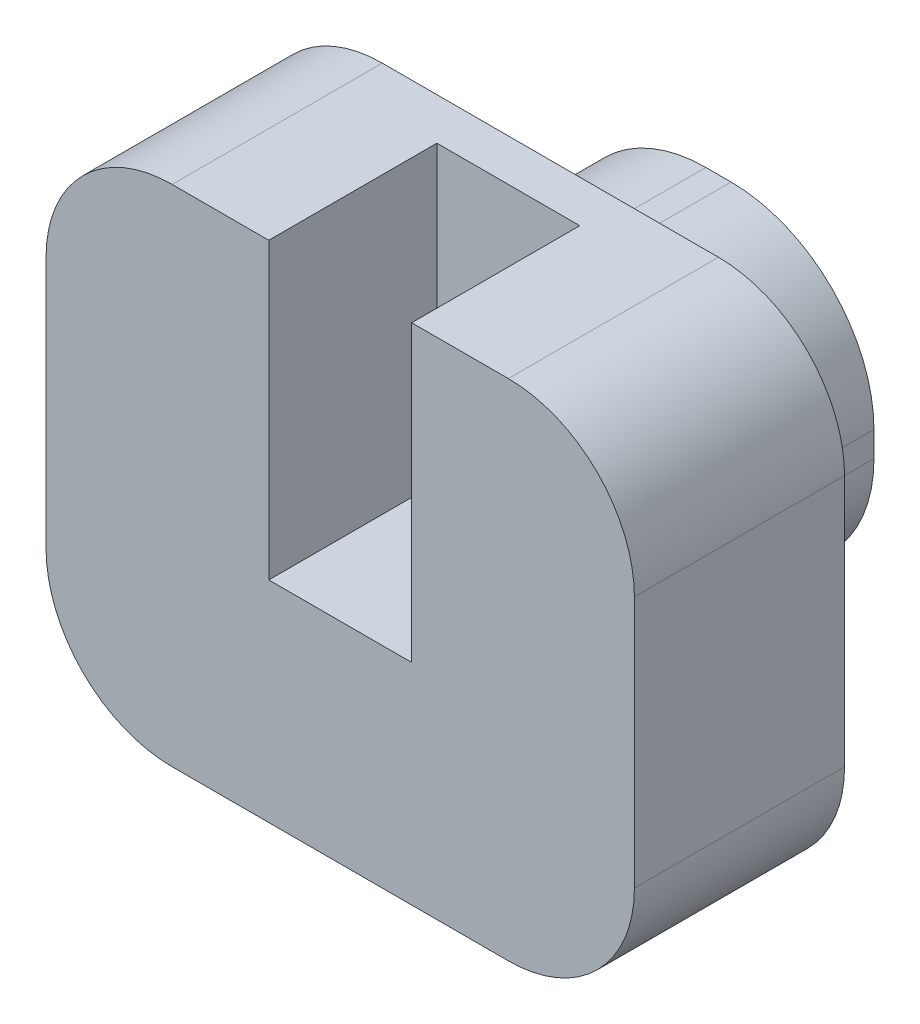
ISO-10303-21;
HEADER;
FILE_DESCRIPTION(('STEP AP214'),'2;1');
FILE_NAME('part.step','',(''),(''),'','','');
FILE_SCHEMA(('AUTOMOTIVE_DESIGN { 1 0 10303 214 1 1 1 1 }'));
ENDSEC;
DATA;
#1=APPLICATION_CONTEXT('core data for automotive mechanical design processes');
#2=APPLICATION_PROTOCOL_DEFINITION('international standard','automotive_design',2000,#1);
#3=PRODUCT_CONTEXT('',#1,'mechanical');
#4=PRODUCT('Part','Part','',(#3));
#5=PRODUCT_RELATED_PRODUCT_CATEGORY('part','',(#4));
#6=PRODUCT_DEFINITION_FORMATION('','',#4);
#7=PRODUCT_DEFINITION_CONTEXT('part definition',#1,'design');
#8=PRODUCT_DEFINITION('design','',#6,#7);
#9=PRODUCT_DEFINITION_SHAPE('','',#8);
#10=(LENGTH_UNIT() NAMED_UNIT(*) SI_UNIT(.MILLI.,.METRE.));
#11=(NAMED_UNIT(*) PLANE_ANGLE_UNIT() SI_UNIT($,.RADIAN.));
#12=(NAMED_UNIT(*) SI_UNIT($,.STERADIAN.) SOLID_ANGLE_UNIT());
#13=UNCERTAINTY_MEASURE_WITH_UNIT(LENGTH_MEASURE(1.E-05),#10,'distance_accuracy_value','');
#14=(GEOMETRIC_REPRESENTATION_CONTEXT(3) GLOBAL_UNCERTAINTY_ASSIGNED_CONTEXT((#13)) GLOBAL_UNIT_ASSIGNED_CONTEXT((#10,
#11,#12)) REPRESENTATION_CONTEXT('',''));
#15=CARTESIAN_POINT('',(0.,0.,0.));
#16=DIRECTION('',(0.,0.,1.));
#17=DIRECTION('',(1.,0.,0.));
#18=AXIS2_PLACEMENT_3D('',#15,#16,#17);
#19=CARTESIAN_POINT('',(-0.15,-0.15,2.));
#20=DIRECTION('',(0.,0.,-1.));
#21=DIRECTION('',(-1.,0.,0.));
#22=AXIS2_PLACEMENT_3D('',#19,#20,#21);
#23=CYLINDRICAL_SURFACE('',#22,1.7);
#24=CARTESIAN_POINT('',(-0.15,-0.15,0.));
#25=DIRECTION('',(0.,0.,1.));
#26=DIRECTION('',(1.,0.,0.));
#27=AXIS2_PLACEMENT_3D('',#24,#25,#26);
#28=CIRCLE('',#27,1.7);
#29=CARTESIAN_POINT('',(-1.85,-0.15,0.));
#30=VERTEX_POINT('',#29);
#31=CARTESIAN_POINT('',(-0.15,-1.85,0.));
#32=VERTEX_POINT('',#31);
#33=EDGE_CURVE('E161',#30,#32,#28,.T.);
#34=ORIENTED_EDGE('',*,*,#33,.T.);
#35=DIRECTION('',(0.,0.,-1.));
#36=VECTOR('',#35,1.);
#37=CARTESIAN_POINT('',(-0.15,-1.85,2.));
#38=LINE('',#37,#36);
#39=CARTESIAN_POINT('',(-0.15,-1.85,2.));
#40=VERTEX_POINT('',#39);
#41=EDGE_CURVE('E11',#40,#32,#38,.T.);
#42=ORIENTED_EDGE('',*,*,#41,.F.);
#43=CARTESIAN_POINT('',(-0.15,-0.15,2.));
#44=DIRECTION('',(0.,0.,1.));
#45=DIRECTION('',(1.,0.,0.));
#46=AXIS2_PLACEMENT_3D('',#43,#44,#45);
#47=CIRCLE('',#46,1.7);
#48=CARTESIAN_POINT('',(-1.85,-0.15,2.));
#49=VERTEX_POINT('',#48);
#50=EDGE_CURVE('E185',#49,#40,#47,.T.);
#51=ORIENTED_EDGE('',*,*,#50,.F.);
#52=DIRECTION('',(0.,0.,-1.));
#53=VECTOR('',#52,1.);
#54=CARTESIAN_POINT('',(-1.85,-0.15,2.));
#55=LINE('',#54,#53);
#56=EDGE_CURVE('E160',#49,#30,#55,.T.);
#57=ORIENTED_EDGE('',*,*,#56,.T.);
#58=EDGE_LOOP('',(#34,#42,#51,#57));
#59=FACE_BOUND('',#58,.T.);
#60=ADVANCED_FACE('F39',(#59),#23,.T.);
#61=CARTESIAN_POINT('',(-0.15,-1.85,2.));
#62=DIRECTION('',(0.,1.,0.));
#63=DIRECTION('',(0.,0.,1.));
#64=AXIS2_PLACEMENT_3D('',#61,#62,#63);
#65=PLANE('',#64);
#66=DIRECTION('',(1.,0.,0.));
#67=VECTOR('',#66,1.);
#68=CARTESIAN_POINT('',(-0.15,-1.85,0.));
#69=LINE('',#68,#67);
#70=CARTESIAN_POINT('',(0.150000000000001,-1.85,0.));
#71=VERTEX_POINT('',#70);
#72=EDGE_CURVE('E165',#32,#71,#69,.T.);
#73=ORIENTED_EDGE('',*,*,#72,.T.);
#74=DIRECTION('',(0.,0.,-1.));
#75=VECTOR('',#74,1.);
#76=CARTESIAN_POINT('',(0.150000000000001,-1.85,2.));
#77=LINE('',#76,#75);
#78=CARTESIAN_POINT('',(0.150000000000001,-1.85,2.));
#79=VERTEX_POINT('',#78);
#80=EDGE_CURVE('E47',#79,#71,#77,.T.);
#81=ORIENTED_EDGE('',*,*,#80,.F.);
#82=DIRECTION('',(1.,0.,0.));
#83=VECTOR('',#82,1.);
#84=CARTESIAN_POINT('',(-0.15,-1.85,2.));
#85=LINE('',#84,#83);
#86=EDGE_CURVE('E104',#40,#79,#85,.T.);
#87=ORIENTED_EDGE('',*,*,#86,.F.);
#88=ORIENTED_EDGE('',*,*,#41,.T.);
#89=EDGE_LOOP('',(#73,#81,#87,#88));
#90=FACE_BOUND('',#89,.T.);
#91=ADVANCED_FACE('F467',(#90),#65,.F.);
#92=CARTESIAN_POINT('',(0.15,-0.15,2.));
#93=DIRECTION('',(0.,0.,-1.));
#94=DIRECTION('',(-1.,0.,0.));
#95=AXIS2_PLACEMENT_3D('',#92,#93,#94);
#96=CYLINDRICAL_SURFACE('',#95,1.7);
#97=CARTESIAN_POINT('',(0.15,-0.15,0.));
#98=DIRECTION('',(0.,0.,1.));
#99=DIRECTION('',(-1.,0.,0.));
#100=AXIS2_PLACEMENT_3D('',#97,#98,#99);
#101=CIRCLE('',#100,1.7);
#102=CARTESIAN_POINT('',(1.85,-0.15,0.));
#103=VERTEX_POINT('',#102);
#104=EDGE_CURVE('E169',#71,#103,#101,.T.);
#105=ORIENTED_EDGE('',*,*,#104,.T.);
#106=DIRECTION('',(0.,0.,-1.));
#107=VECTOR('',#106,1.);
#108=CARTESIAN_POINT('',(1.85,-0.15,2.));
#109=LINE('',#108,#107);
#110=CARTESIAN_POINT('',(1.85,-0.15,2.));
#111=VERTEX_POINT('',#110);
#112=EDGE_CURVE('E194',#111,#103,#109,.T.);
#113=ORIENTED_EDGE('',*,*,#112,.F.);
#114=CARTESIAN_POINT('',(0.15,-0.15,2.));
#115=DIRECTION('',(0.,0.,1.));
#116=DIRECTION('',(-1.,0.,0.));
#117=AXIS2_PLACEMENT_3D('',#114,#115,#116);
#118=CIRCLE('',#117,1.7);
#119=EDGE_CURVE('E151',#79,#111,#118,.T.);
#120=ORIENTED_EDGE('',*,*,#119,.F.);
#121=ORIENTED_EDGE('',*,*,#80,.T.);
#122=EDGE_LOOP('',(#105,#113,#120,#121));
#123=FACE_BOUND('',#122,.T.);
#124=ADVANCED_FACE('F202',(#123),#96,.T.);
#125=CARTESIAN_POINT('',(1.85,-0.15,2.));
#126=DIRECTION('',(-1.,0.,0.));
#127=DIRECTION('',(0.,0.,1.));
#128=AXIS2_PLACEMENT_3D('',#125,#126,#127);
#129=PLANE('',#128);
#130=DIRECTION('',(0.,1.,0.));
#131=VECTOR('',#130,1.);
#132=CARTESIAN_POINT('',(1.85,-0.15,0.));
#133=LINE('',#132,#131);
#134=CARTESIAN_POINT('',(1.85,0.150000000000001,0.));
#135=VERTEX_POINT('',#134);
#136=EDGE_CURVE('E172',#103,#135,#133,.T.);
#137=ORIENTED_EDGE('',*,*,#136,.T.);
#138=DIRECTION('',(0.,0.,-1.));
#139=VECTOR('',#138,1.);
#140=CARTESIAN_POINT('',(1.85,0.150000000000001,2.));
#141=LINE('',#140,#139);
#142=CARTESIAN_POINT('',(1.85,0.150000000000001,2.));
#143=VERTEX_POINT('',#142);
#144=EDGE_CURVE('E131',#143,#135,#141,.T.);
#145=ORIENTED_EDGE('',*,*,#144,.F.);
#146=DIRECTION('',(0.,1.,0.));
#147=VECTOR('',#146,1.);
#148=CARTESIAN_POINT('',(1.85,-0.15,2.));
#149=LINE('',#148,#147);
#150=EDGE_CURVE('E147',#111,#143,#149,.T.);
#151=ORIENTED_EDGE('',*,*,#150,.F.);
#152=ORIENTED_EDGE('',*,*,#112,.T.);
#153=EDGE_LOOP('',(#137,#145,#151,#152));
#154=FACE_BOUND('',#153,.T.);
#155=ADVANCED_FACE('F208',(#154),#129,.F.);
#156=CARTESIAN_POINT('',(0.15,0.150000000000001,2.));
#157=DIRECTION('',(0.,0.,-1.));
#158=DIRECTION('',(-1.,0.,0.));
#159=AXIS2_PLACEMENT_3D('',#156,#157,#158);
#160=CYLINDRICAL_SURFACE('',#159,1.7);
#161=CARTESIAN_POINT('',(0.15,0.150000000000001,0.));
#162=DIRECTION('',(0.,0.,1.));
#163=DIRECTION('',(1.,0.,0.));
#164=AXIS2_PLACEMENT_3D('',#161,#162,#163);
#165=CIRCLE('',#164,1.7);
#166=CARTESIAN_POINT('',(0.15,1.85,0.));
#167=VERTEX_POINT('',#166);
#168=EDGE_CURVE('E127',#135,#167,#165,.T.);
#169=ORIENTED_EDGE('',*,*,#168,.T.);
#170=DIRECTION('',(0.,0.,-1.));
#171=VECTOR('',#170,1.);
#172=CARTESIAN_POINT('',(0.15,1.85,2.));
#173=LINE('',#172,#171);
#174=CARTESIAN_POINT('',(0.15,1.85,2.));
#175=VERTEX_POINT('',#174);
#176=EDGE_CURVE('E119',#175,#167,#173,.T.);
#177=ORIENTED_EDGE('',*,*,#176,.F.);
#178=CARTESIAN_POINT('',(0.15,0.150000000000001,2.));
#179=DIRECTION('',(0.,0.,1.));
#180=DIRECTION('',(1.,0.,0.));
#181=AXIS2_PLACEMENT_3D('',#178,#179,#180);
#182=CIRCLE('',#181,1.7);
#183=EDGE_CURVE('E124',#143,#175,#182,.T.);
#184=ORIENTED_EDGE('',*,*,#183,.F.);
#185=ORIENTED_EDGE('',*,*,#144,.T.);
#186=EDGE_LOOP('',(#169,#177,#184,#185));
#187=FACE_BOUND('',#186,.T.);
#188=ADVANCED_FACE('F121',(#187),#160,.T.);
#189=CARTESIAN_POINT('',(-0.15,1.85,2.));
#190=DIRECTION('',(0.,-1.,0.));
#191=DIRECTION('',(0.,0.,-1.));
#192=AXIS2_PLACEMENT_3D('',#189,#190,#191);
#193=PLANE('',#192);
#194=DIRECTION('',(-1.,0.,0.));
#195=VECTOR('',#194,1.);
#196=CARTESIAN_POINT('',(-0.15,1.85,0.));
#197=LINE('',#196,#195);
#198=CARTESIAN_POINT('',(-0.15,1.85,0.));
#199=VERTEX_POINT('',#198);
#200=EDGE_CURVE('E177',#167,#199,#197,.T.);
#201=ORIENTED_EDGE('',*,*,#200,.T.);
#202=DIRECTION('',(0.,0.,-1.));
#203=VECTOR('',#202,1.);
#204=CARTESIAN_POINT('',(-0.15,1.85,2.));
#205=LINE('',#204,#203);
#206=CARTESIAN_POINT('',(-0.15,1.85,2.));
#207=VERTEX_POINT('',#206);
#208=EDGE_CURVE('E132',#207,#199,#205,.T.);
#209=ORIENTED_EDGE('',*,*,#208,.F.);
#210=DIRECTION('',(-1.,0.,0.));
#211=VECTOR('',#210,1.);
#212=CARTESIAN_POINT('',(-0.15,1.85,2.));
#213=LINE('',#212,#211);
#214=EDGE_CURVE('E135',#175,#207,#213,.T.);
#215=ORIENTED_EDGE('',*,*,#214,.F.);
#216=ORIENTED_EDGE('',*,*,#176,.T.);
#217=EDGE_LOOP('',(#201,#209,#215,#216));
#218=FACE_BOUND('',#217,.T.);
#219=ADVANCED_FACE('F136',(#218),#193,.F.);
#220=CARTESIAN_POINT('',(-0.15,0.150000000000001,2.));
#221=DIRECTION('',(0.,0.,-1.));
#222=DIRECTION('',(-1.,0.,0.));
#223=AXIS2_PLACEMENT_3D('',#220,#221,#222);
#224=CYLINDRICAL_SURFACE('',#223,1.7);
#225=CARTESIAN_POINT('',(-0.15,0.150000000000001,0.));
#226=DIRECTION('',(0.,0.,1.));
#227=DIRECTION('',(1.,0.,0.));
#228=AXIS2_PLACEMENT_3D('',#225,#226,#227);
#229=CIRCLE('',#228,1.7);
#230=CARTESIAN_POINT('',(-1.85,0.150000000000001,0.));
#231=VERTEX_POINT('',#230);
#232=EDGE_CURVE('E180',#199,#231,#229,.T.);
#233=ORIENTED_EDGE('',*,*,#232,.T.);
#234=DIRECTION('',(0.,0.,-1.));
#235=VECTOR('',#234,1.);
#236=CARTESIAN_POINT('',(-1.85,0.150000000000001,2.));
#237=LINE('',#236,#235);
#238=CARTESIAN_POINT('',(-1.85,0.150000000000001,2.));
#239=VERTEX_POINT('',#238);
#240=EDGE_CURVE('E63',#239,#231,#237,.T.);
#241=ORIENTED_EDGE('',*,*,#240,.F.);
#242=CARTESIAN_POINT('',(-0.15,0.150000000000001,2.));
#243=DIRECTION('',(0.,0.,1.));
#244=DIRECTION('',(1.,0.,0.));
#245=AXIS2_PLACEMENT_3D('',#242,#243,#244);
#246=CIRCLE('',#245,1.7);
#247=EDGE_CURVE('E141',#207,#239,#246,.T.);
#248=ORIENTED_EDGE('',*,*,#247,.F.);
#249=ORIENTED_EDGE('',*,*,#208,.T.);
#250=EDGE_LOOP('',(#233,#241,#248,#249));
#251=FACE_BOUND('',#250,.T.);
#252=ADVANCED_FACE('F474',(#251),#224,.T.);
#253=CARTESIAN_POINT('',(-1.85,-0.15,2.));
#254=DIRECTION('',(1.,0.,0.));
#255=DIRECTION('',(0.,0.,-1.));
#256=AXIS2_PLACEMENT_3D('',#253,#254,#255);
#257=PLANE('',#256);
#258=DIRECTION('',(0.,-1.,0.));
#259=VECTOR('',#258,1.);
#260=CARTESIAN_POINT('',(-1.85,-0.15,0.));
#261=LINE('',#260,#259);
#262=EDGE_CURVE('E96',#231,#30,#261,.T.);
#263=ORIENTED_EDGE('',*,*,#262,.T.);
#264=ORIENTED_EDGE('',*,*,#56,.F.);
#265=DIRECTION('',(0.,-1.,0.));
#266=VECTOR('',#265,1.);
#267=CARTESIAN_POINT('',(-1.85,-0.15,2.));
#268=LINE('',#267,#266);
#269=EDGE_CURVE('E157',#239,#49,#268,.T.);
#270=ORIENTED_EDGE('',*,*,#269,.F.);
#271=ORIENTED_EDGE('',*,*,#240,.T.);
#272=EDGE_LOOP('',(#263,#264,#270,#271));
#273=FACE_BOUND('',#272,.T.);
#274=ADVANCED_FACE('F475',(#273),#257,.F.);
#275=CARTESIAN_POINT('',(-0.15,-0.15,0.));
#276=DIRECTION('',(0.,0.,1.));
#277=DIRECTION('',(1.,0.,0.));
#278=AXIS2_PLACEMENT_3D('',#275,#276,#277);
#279=PLANE('',#278);
#280=ORIENTED_EDGE('',*,*,#33,.F.);
#281=ORIENTED_EDGE('',*,*,#262,.F.);
#282=ORIENTED_EDGE('',*,*,#232,.F.);
#283=ORIENTED_EDGE('',*,*,#200,.F.);
#284=ORIENTED_EDGE('',*,*,#168,.F.);
#285=ORIENTED_EDGE('',*,*,#136,.F.);
#286=ORIENTED_EDGE('',*,*,#104,.F.);
#287=ORIENTED_EDGE('',*,*,#72,.F.);
#288=EDGE_LOOP('',(#280,#281,#282,#283,#284,#285,#286,#287));
#289=FACE_BOUND('',#288,.T.);
#290=ADVANCED_FACE('F206',(#289),#279,.F.);
#291=CARTESIAN_POINT('',(2.,1.5,2.));
#292=DIRECTION('',(0.,0.,1.));
#293=DIRECTION('',(1.,0.,0.));
#294=AXIS2_PLACEMENT_3D('',#291,#292,#293);
#295=PLANE('',#294);
#296=DIRECTION('',(1.,0.,0.));
#297=VECTOR('',#296,1.);
#298=CARTESIAN_POINT('',(-2.,3.,2.));
#299=LINE('',#298,#297);
#300=CARTESIAN_POINT('',(-2.,3.,2.));
#301=VERTEX_POINT('',#300);
#302=CARTESIAN_POINT('',(2.,3.,2.));
#303=VERTEX_POINT('',#302);
#304=EDGE_CURVE('E277',#301,#303,#299,.T.);
#305=ORIENTED_EDGE('',*,*,#304,.T.);
#306=CARTESIAN_POINT('',(2.,1.5,2.));
#307=DIRECTION('',(0.,0.,1.));
#308=DIRECTION('',(1.,0.,0.));
#309=AXIS2_PLACEMENT_3D('',#306,#307,#308);
#310=CIRCLE('',#309,1.5);
#311=CARTESIAN_POINT('',(3.5,1.5,2.));
#312=VERTEX_POINT('',#311);
#313=EDGE_CURVE('E273',#312,#303,#310,.T.);
#314=ORIENTED_EDGE('',*,*,#313,.F.);
#315=DIRECTION('',(0.,1.,0.));
#316=VECTOR('',#315,1.);
#317=CARTESIAN_POINT('',(3.5,-1.5,2.));
#318=LINE('',#317,#316);
#319=CARTESIAN_POINT('',(3.5,-1.5,2.));
#320=VERTEX_POINT('',#319);
#321=EDGE_CURVE('E269',#320,#312,#318,.T.);
#322=ORIENTED_EDGE('',*,*,#321,.F.);
#323=CARTESIAN_POINT('',(2.,-1.5,2.));
#324=DIRECTION('',(0.,0.,1.));
#325=DIRECTION('',(1.,0.,0.));
#326=AXIS2_PLACEMENT_3D('',#323,#324,#325);
#327=CIRCLE('',#326,1.5);
#328=CARTESIAN_POINT('',(2.,-3.,2.));
#329=VERTEX_POINT('',#328);
#330=EDGE_CURVE('E265',#329,#320,#327,.T.);
#331=ORIENTED_EDGE('',*,*,#330,.F.);
#332=DIRECTION('',(1.,0.,0.));
#333=VECTOR('',#332,1.);
#334=CARTESIAN_POINT('',(-2.,-3.,2.));
#335=LINE('',#334,#333);
#336=CARTESIAN_POINT('',(-2.,-3.,2.));
#337=VERTEX_POINT('',#336);
#338=EDGE_CURVE('E261',#337,#329,#335,.T.);
#339=ORIENTED_EDGE('',*,*,#338,.F.);
#340=CARTESIAN_POINT('',(-2.,-1.5,2.));
#341=DIRECTION('',(0.,0.,-1.));
#342=DIRECTION('',(-1.,0.,0.));
#343=AXIS2_PLACEMENT_3D('',#340,#341,#342);
#344=CIRCLE('',#343,1.5);
#345=CARTESIAN_POINT('',(-3.5,-1.5,2.));
#346=VERTEX_POINT('',#345);
#347=EDGE_CURVE('E257',#337,#346,#344,.T.);
#348=ORIENTED_EDGE('',*,*,#347,.T.);
#349=DIRECTION('',(0.,1.,0.));
#350=VECTOR('',#349,1.);
#351=CARTESIAN_POINT('',(-3.5,-1.5,2.));
#352=LINE('',#351,#350);
#353=CARTESIAN_POINT('',(-3.5,1.5,2.));
#354=VERTEX_POINT('',#353);
#355=EDGE_CURVE('E253',#346,#354,#352,.T.);
#356=ORIENTED_EDGE('',*,*,#355,.T.);
#357=CARTESIAN_POINT('',(-2.,1.5,2.));
#358=DIRECTION('',(0.,0.,-1.));
#359=DIRECTION('',(-1.,0.,0.));
#360=AXIS2_PLACEMENT_3D('',#357,#358,#359);
#361=CIRCLE('',#360,1.5);
#362=EDGE_CURVE('E248',#354,#301,#361,.T.);
#363=ORIENTED_EDGE('',*,*,#362,.T.);
#364=EDGE_LOOP('',(#305,#314,#322,#331,#339,#348,#356,#363));
#365=FACE_BOUND('',#364,.T.);
#366=ORIENTED_EDGE('',*,*,#269,.T.);
#367=ORIENTED_EDGE('',*,*,#50,.T.);
#368=ORIENTED_EDGE('',*,*,#86,.T.);
#369=ORIENTED_EDGE('',*,*,#119,.T.);
#370=ORIENTED_EDGE('',*,*,#150,.T.);
#371=ORIENTED_EDGE('',*,*,#183,.T.);
#372=ORIENTED_EDGE('',*,*,#214,.T.);
#373=ORIENTED_EDGE('',*,*,#247,.T.);
#374=EDGE_LOOP('',(#366,#367,#368,#369,#370,#371,#372,#373));
#375=FACE_BOUND('',#374,.T.);
#376=ADVANCED_FACE('F144',(#365,#375),#295,.F.);
#377=CARTESIAN_POINT('',(-2.,3.,4.5));
#378=DIRECTION('',(0.,1.,0.));
#379=DIRECTION('',(0.,0.,1.));
#380=AXIS2_PLACEMENT_3D('',#377,#378,#379);
#381=PLANE('',#380);
#382=DIRECTION('',(0.,0.,-1.));
#383=VECTOR('',#382,1.);
#384=CARTESIAN_POINT('',(0.850000000000001,3.,4.5));
#385=LINE('',#384,#383);
#386=CARTESIAN_POINT('',(0.850000000000001,3.,4.5));
#387=VERTEX_POINT('',#386);
#388=CARTESIAN_POINT('',(0.850000000000001,3.,2.5));
#389=VERTEX_POINT('',#388);
#390=EDGE_CURVE('E338',#387,#389,#385,.T.);
#391=ORIENTED_EDGE('',*,*,#390,.F.);
#392=DIRECTION('',(1.,0.,0.));
#393=VECTOR('',#392,1.);
#394=CARTESIAN_POINT('',(-2.,3.,4.5));
#395=LINE('',#394,#393);
#396=CARTESIAN_POINT('',(2.,3.,4.5));
#397=VERTEX_POINT('',#396);
#398=EDGE_CURVE('E252',#387,#397,#395,.T.);
#399=ORIENTED_EDGE('',*,*,#398,.T.);
#400=DIRECTION('',(0.,0.,-1.));
#401=VECTOR('',#400,1.);
#402=CARTESIAN_POINT('',(2.,3.,4.5));
#403=LINE('',#402,#401);
#404=EDGE_CURVE('E216',#397,#303,#403,.T.);
#405=ORIENTED_EDGE('',*,*,#404,.T.);
#406=ORIENTED_EDGE('',*,*,#304,.F.);
#407=DIRECTION('',(0.,0.,-1.));
#408=VECTOR('',#407,1.);
#409=CARTESIAN_POINT('',(-2.,3.,4.5));
#410=LINE('',#409,#408);
#411=CARTESIAN_POINT('',(-2.,3.,4.5));
#412=VERTEX_POINT('',#411);
#413=EDGE_CURVE('E166',#412,#301,#410,.T.);
#414=ORIENTED_EDGE('',*,*,#413,.F.);
#415=CARTESIAN_POINT('',(-0.849999999999999,3.,4.5));
#416=VERTEX_POINT('',#415);
#417=EDGE_CURVE('E309',#412,#416,#395,.T.);
#418=ORIENTED_EDGE('',*,*,#417,.T.);
#419=DIRECTION('',(0.,0.,1.));
#420=VECTOR('',#419,1.);
#421=CARTESIAN_POINT('',(-0.849999999999999,3.,4.5));
#422=LINE('',#421,#420);
#423=CARTESIAN_POINT('',(-0.849999999999999,3.,2.5));
#424=VERTEX_POINT('',#423);
#425=EDGE_CURVE('E329',#424,#416,#422,.T.);
#426=ORIENTED_EDGE('',*,*,#425,.F.);
#427=DIRECTION('',(-1.,0.,0.));
#428=VECTOR('',#427,1.);
#429=CARTESIAN_POINT('',(-0.849999999999999,3.,2.5));
#430=LINE('',#429,#428);
#431=EDGE_CURVE('E334',#389,#424,#430,.T.);
#432=ORIENTED_EDGE('',*,*,#431,.F.);
#433=EDGE_LOOP('',(#391,#399,#405,#406,#414,#418,#426,#432));
#434=FACE_BOUND('',#433,.T.);
#435=ADVANCED_FACE('F418',(#434),#381,.T.);
#436=CARTESIAN_POINT('',(-2.,1.5,4.5));
#437=DIRECTION('',(0.,0.,-1.));
#438=DIRECTION('',(-1.,0.,0.));
#439=AXIS2_PLACEMENT_3D('',#436,#437,#438);
#440=CYLINDRICAL_SURFACE('',#439,1.5);
#441=ORIENTED_EDGE('',*,*,#362,.F.);
#442=DIRECTION('',(0.,0.,-1.));
#443=VECTOR('',#442,1.);
#444=CARTESIAN_POINT('',(-3.5,1.5,4.5));
#445=LINE('',#444,#443);
#446=CARTESIAN_POINT('',(-3.5,1.5,4.5));
#447=VERTEX_POINT('',#446);
#448=EDGE_CURVE('E241',#447,#354,#445,.T.);
#449=ORIENTED_EDGE('',*,*,#448,.F.);
#450=CARTESIAN_POINT('',(-2.,1.5,4.5));
#451=DIRECTION('',(0.,0.,-1.));
#452=DIRECTION('',(-1.,0.,0.));
#453=AXIS2_PLACEMENT_3D('',#450,#451,#452);
#454=CIRCLE('',#453,1.5);
#455=EDGE_CURVE('E221',#447,#412,#454,.T.);
#456=ORIENTED_EDGE('',*,*,#455,.T.);
#457=ORIENTED_EDGE('',*,*,#413,.T.);
#458=EDGE_LOOP('',(#441,#449,#456,#457));
#459=FACE_BOUND('',#458,.T.);
#460=ADVANCED_FACE('F414',(#459),#440,.T.);
#461=CARTESIAN_POINT('',(-3.5,-1.5,4.5));
#462=DIRECTION('',(-1.,0.,0.));
#463=DIRECTION('',(0.,0.,1.));
#464=AXIS2_PLACEMENT_3D('',#461,#462,#463);
#465=PLANE('',#464);
#466=ORIENTED_EDGE('',*,*,#355,.F.);
#467=DIRECTION('',(0.,0.,-1.));
#468=VECTOR('',#467,1.);
#469=CARTESIAN_POINT('',(-3.5,-1.5,4.5));
#470=LINE('',#469,#468);
#471=CARTESIAN_POINT('',(-3.5,-1.5,4.5));
#472=VERTEX_POINT('',#471);
#473=EDGE_CURVE('E237',#472,#346,#470,.T.);
#474=ORIENTED_EDGE('',*,*,#473,.F.);
#475=DIRECTION('',(0.,1.,0.));
#476=VECTOR('',#475,1.);
#477=CARTESIAN_POINT('',(-3.5,-1.5,4.5));
#478=LINE('',#477,#476);
#479=EDGE_CURVE('E285',#472,#447,#478,.T.);
#480=ORIENTED_EDGE('',*,*,#479,.T.);
#481=ORIENTED_EDGE('',*,*,#448,.T.);
#482=EDGE_LOOP('',(#466,#474,#480,#481));
#483=FACE_BOUND('',#482,.T.);
#484=ADVANCED_FACE('F426',(#483),#465,.T.);
#485=CARTESIAN_POINT('',(-2.,-1.5,4.5));
#486=DIRECTION('',(0.,0.,-1.));
#487=DIRECTION('',(-1.,0.,0.));
#488=AXIS2_PLACEMENT_3D('',#485,#486,#487);
#489=CYLINDRICAL_SURFACE('',#488,1.5);
#490=ORIENTED_EDGE('',*,*,#347,.F.);
#491=DIRECTION('',(0.,0.,-1.));
#492=VECTOR('',#491,1.);
#493=CARTESIAN_POINT('',(-2.,-3.,4.5));
#494=LINE('',#493,#492);
#495=CARTESIAN_POINT('',(-2.,-3.,4.5));
#496=VERTEX_POINT('',#495);
#497=EDGE_CURVE('E233',#496,#337,#494,.T.);
#498=ORIENTED_EDGE('',*,*,#497,.F.);
#499=CARTESIAN_POINT('',(-2.,-1.5,4.5));
#500=DIRECTION('',(0.,0.,-1.));
#501=DIRECTION('',(-1.,0.,0.));
#502=AXIS2_PLACEMENT_3D('',#499,#500,#501);
#503=CIRCLE('',#502,1.5);
#504=EDGE_CURVE('E289',#496,#472,#503,.T.);
#505=ORIENTED_EDGE('',*,*,#504,.T.);
#506=ORIENTED_EDGE('',*,*,#473,.T.);
#507=EDGE_LOOP('',(#490,#498,#505,#506));
#508=FACE_BOUND('',#507,.T.);
#509=ADVANCED_FACE('F457',(#508),#489,.T.);
#510=CARTESIAN_POINT('',(-2.,-3.,4.5));
#511=DIRECTION('',(0.,1.,0.));
#512=DIRECTION('',(0.,0.,1.));
#513=AXIS2_PLACEMENT_3D('',#510,#511,#512);
#514=PLANE('',#513);
#515=ORIENTED_EDGE('',*,*,#338,.T.);
#516=DIRECTION('',(0.,0.,-1.));
#517=VECTOR('',#516,1.);
#518=CARTESIAN_POINT('',(2.,-3.,4.5));
#519=LINE('',#518,#517);
#520=CARTESIAN_POINT('',(2.,-3.,4.5));
#521=VERTEX_POINT('',#520);
#522=EDGE_CURVE('E229',#521,#329,#519,.T.);
#523=ORIENTED_EDGE('',*,*,#522,.F.);
#524=DIRECTION('',(1.,0.,0.));
#525=VECTOR('',#524,1.);
#526=CARTESIAN_POINT('',(-2.,-3.,4.5));
#527=LINE('',#526,#525);
#528=EDGE_CURVE('E293',#496,#521,#527,.T.);
#529=ORIENTED_EDGE('',*,*,#528,.F.);
#530=ORIENTED_EDGE('',*,*,#497,.T.);
#531=EDGE_LOOP('',(#515,#523,#529,#530));
#532=FACE_BOUND('',#531,.T.);
#533=ADVANCED_FACE('F455',(#532),#514,.F.);
#534=CARTESIAN_POINT('',(2.,-1.5,4.5));
#535=DIRECTION('',(0.,0.,-1.));
#536=DIRECTION('',(-1.,0.,0.));
#537=AXIS2_PLACEMENT_3D('',#534,#535,#536);
#538=CYLINDRICAL_SURFACE('',#537,1.5);
#539=ORIENTED_EDGE('',*,*,#330,.T.);
#540=DIRECTION('',(0.,0.,-1.));
#541=VECTOR('',#540,1.);
#542=CARTESIAN_POINT('',(3.5,-1.5,4.5));
#543=LINE('',#542,#541);
#544=CARTESIAN_POINT('',(3.5,-1.5,4.5));
#545=VERTEX_POINT('',#544);
#546=EDGE_CURVE('E225',#545,#320,#543,.T.);
#547=ORIENTED_EDGE('',*,*,#546,.F.);
#548=CARTESIAN_POINT('',(2.,-1.5,4.5));
#549=DIRECTION('',(0.,0.,1.));
#550=DIRECTION('',(1.,0.,0.));
#551=AXIS2_PLACEMENT_3D('',#548,#549,#550);
#552=CIRCLE('',#551,1.5);
#553=EDGE_CURVE('E297',#521,#545,#552,.T.);
#554=ORIENTED_EDGE('',*,*,#553,.F.);
#555=ORIENTED_EDGE('',*,*,#522,.T.);
#556=EDGE_LOOP('',(#539,#547,#554,#555));
#557=FACE_BOUND('',#556,.T.);
#558=ADVANCED_FACE('F451',(#557),#538,.T.);
#559=CARTESIAN_POINT('',(3.5,-1.5,4.5));
#560=DIRECTION('',(-1.,0.,0.));
#561=DIRECTION('',(0.,-1.,0.));
#562=AXIS2_PLACEMENT_3D('',#559,#560,#561);
#563=PLANE('',#562);
#564=ORIENTED_EDGE('',*,*,#321,.T.);
#565=DIRECTION('',(0.,0.,-1.));
#566=VECTOR('',#565,1.);
#567=CARTESIAN_POINT('',(3.5,1.5,4.5));
#568=LINE('',#567,#566);
#569=CARTESIAN_POINT('',(3.5,1.5,4.5));
#570=VERTEX_POINT('',#569);
#571=EDGE_CURVE('E220',#570,#312,#568,.T.);
#572=ORIENTED_EDGE('',*,*,#571,.F.);
#573=DIRECTION('',(0.,1.,0.));
#574=VECTOR('',#573,1.);
#575=CARTESIAN_POINT('',(3.5,-1.5,4.5));
#576=LINE('',#575,#574);
#577=EDGE_CURVE('E301',#545,#570,#576,.T.);
#578=ORIENTED_EDGE('',*,*,#577,.F.);
#579=ORIENTED_EDGE('',*,*,#546,.T.);
#580=EDGE_LOOP('',(#564,#572,#578,#579));
#581=FACE_BOUND('',#580,.T.);
#582=ADVANCED_FACE('F447',(#581),#563,.F.);
#583=CARTESIAN_POINT('',(2.,1.5,4.5));
#584=DIRECTION('',(0.,0.,-1.));
#585=DIRECTION('',(-1.,0.,0.));
#586=AXIS2_PLACEMENT_3D('',#583,#584,#585);
#587=CYLINDRICAL_SURFACE('',#586,1.5);
#588=ORIENTED_EDGE('',*,*,#313,.T.);
#589=ORIENTED_EDGE('',*,*,#404,.F.);
#590=CARTESIAN_POINT('',(2.,1.5,4.5));
#591=DIRECTION('',(0.,0.,1.));
#592=DIRECTION('',(1.,0.,0.));
#593=AXIS2_PLACEMENT_3D('',#590,#591,#592);
#594=CIRCLE('',#593,1.5);
#595=EDGE_CURVE('E305',#570,#397,#594,.T.);
#596=ORIENTED_EDGE('',*,*,#595,.F.);
#597=ORIENTED_EDGE('',*,*,#571,.T.);
#598=EDGE_LOOP('',(#588,#589,#596,#597));
#599=FACE_BOUND('',#598,.T.);
#600=ADVANCED_FACE('F443',(#599),#587,.T.);
#601=CARTESIAN_POINT('',(2.,1.5,4.5));
#602=DIRECTION('',(0.,0.,1.));
#603=DIRECTION('',(1.,0.,0.));
#604=AXIS2_PLACEMENT_3D('',#601,#602,#603);
#605=PLANE('',#604);
#606=DIRECTION('',(0.,1.,0.));
#607=VECTOR('',#606,1.);
#608=CARTESIAN_POINT('',(0.850000000000001,-0.500000000000001,4.5));
#609=LINE('',#608,#607);
#610=CARTESIAN_POINT('',(0.850000000000001,-0.500000000000001,4.5));
#611=VERTEX_POINT('',#610);
#612=EDGE_CURVE('E281',#611,#387,#609,.T.);
#613=ORIENTED_EDGE('',*,*,#612,.F.);
#614=DIRECTION('',(1.,0.,0.));
#615=VECTOR('',#614,1.);
#616=CARTESIAN_POINT('',(-0.849999999999999,-0.500000000000001,4.5));
#617=LINE('',#616,#615);
#618=CARTESIAN_POINT('',(-0.849999999999999,-0.500000000000001,4.5));
#619=VERTEX_POINT('',#618);
#620=EDGE_CURVE('E318',#619,#611,#617,.T.);
#621=ORIENTED_EDGE('',*,*,#620,.F.);
#622=DIRECTION('',(0.,1.,0.));
#623=VECTOR('',#622,1.);
#624=CARTESIAN_POINT('',(-0.849999999999999,-0.500000000000001,4.5));
#625=LINE('',#624,#623);
#626=EDGE_CURVE('E322',#619,#416,#625,.T.);
#627=ORIENTED_EDGE('',*,*,#626,.T.);
#628=ORIENTED_EDGE('',*,*,#417,.F.);
#629=ORIENTED_EDGE('',*,*,#455,.F.);
#630=ORIENTED_EDGE('',*,*,#479,.F.);
#631=ORIENTED_EDGE('',*,*,#504,.F.);
#632=ORIENTED_EDGE('',*,*,#528,.T.);
#633=ORIENTED_EDGE('',*,*,#553,.T.);
#634=ORIENTED_EDGE('',*,*,#577,.T.);
#635=ORIENTED_EDGE('',*,*,#595,.T.);
#636=ORIENTED_EDGE('',*,*,#398,.F.);
#637=EDGE_LOOP('',(#613,#621,#627,#628,#629,#630,#631,#632,#633,#634,#635,#636));
#638=FACE_BOUND('',#637,.T.);
#639=ADVANCED_FACE('F430',(#638),#605,.T.);
#640=CARTESIAN_POINT('',(0.850000000000001,-0.500000000000001,4.5));
#641=DIRECTION('',(1.,0.,0.));
#642=DIRECTION('',(0.,0.,-1.));
#643=AXIS2_PLACEMENT_3D('',#640,#641,#642);
#644=PLANE('',#643);
#645=ORIENTED_EDGE('',*,*,#390,.T.);
#646=DIRECTION('',(0.,1.,0.));
#647=VECTOR('',#646,1.);
#648=CARTESIAN_POINT('',(0.850000000000001,-0.500000000000001,2.5));
#649=LINE('',#648,#647);
#650=CARTESIAN_POINT('',(0.850000000000001,-0.500000000000001,2.5));
#651=VERTEX_POINT('',#650);
#652=EDGE_CURVE('E313',#651,#389,#649,.T.);
#653=ORIENTED_EDGE('',*,*,#652,.F.);
#654=DIRECTION('',(0.,0.,-1.));
#655=VECTOR('',#654,1.);
#656=CARTESIAN_POINT('',(0.850000000000001,-0.500000000000001,4.5));
#657=LINE('',#656,#655);
#658=EDGE_CURVE('E333',#611,#651,#657,.T.);
#659=ORIENTED_EDGE('',*,*,#658,.F.);
#660=ORIENTED_EDGE('',*,*,#612,.T.);
#661=EDGE_LOOP('',(#645,#653,#659,#660));
#662=FACE_BOUND('',#661,.T.);
#663=ADVANCED_FACE('F363',(#662),#644,.F.);
#664=CARTESIAN_POINT('',(-0.849999999999999,-0.500000000000001,4.5));
#665=DIRECTION('',(-1.,0.,0.));
#666=DIRECTION('',(0.,0.,1.));
#667=AXIS2_PLACEMENT_3D('',#664,#665,#666);
#668=PLANE('',#667);
#669=ORIENTED_EDGE('',*,*,#425,.T.);
#670=ORIENTED_EDGE('',*,*,#626,.F.);
#671=DIRECTION('',(0.,0.,1.));
#672=VECTOR('',#671,1.);
#673=CARTESIAN_POINT('',(-0.849999999999999,-0.500000000000001,4.5));
#674=LINE('',#673,#672);
#675=CARTESIAN_POINT('',(-0.849999999999999,-0.500000000000001,2.5));
#676=VERTEX_POINT('',#675);
#677=EDGE_CURVE('E54',#676,#619,#674,.T.);
#678=ORIENTED_EDGE('',*,*,#677,.F.);
#679=DIRECTION('',(0.,1.,0.));
#680=VECTOR('',#679,1.);
#681=CARTESIAN_POINT('',(-0.849999999999999,-0.500000000000001,2.5));
#682=LINE('',#681,#680);
#683=EDGE_CURVE('E317',#676,#424,#682,.T.);
#684=ORIENTED_EDGE('',*,*,#683,.T.);
#685=EDGE_LOOP('',(#669,#670,#678,#684));
#686=FACE_BOUND('',#685,.T.);
#687=ADVANCED_FACE('F434',(#686),#668,.F.);
#688=CARTESIAN_POINT('',(-0.849999999999999,-0.500000000000001,2.5));
#689=DIRECTION('',(0.,0.,-1.));
#690=DIRECTION('',(-1.,0.,0.));
#691=AXIS2_PLACEMENT_3D('',#688,#689,#690);
#692=PLANE('',#691);
#693=ORIENTED_EDGE('',*,*,#431,.T.);
#694=ORIENTED_EDGE('',*,*,#683,.F.);
#695=DIRECTION('',(-1.,0.,0.));
#696=VECTOR('',#695,1.);
#697=CARTESIAN_POINT('',(-0.849999999999999,-0.500000000000001,2.5));
#698=LINE('',#697,#696);
#699=EDGE_CURVE('E346',#651,#676,#698,.T.);
#700=ORIENTED_EDGE('',*,*,#699,.F.);
#701=ORIENTED_EDGE('',*,*,#652,.T.);
#702=EDGE_LOOP('',(#693,#694,#700,#701));
#703=FACE_BOUND('',#702,.T.);
#704=ADVANCED_FACE('F436',(#703),#692,.F.);
#705=CARTESIAN_POINT('',(0.,-0.500000000000001,0.));
#706=DIRECTION('',(0.,-1.,0.));
#707=DIRECTION('',(0.,0.,-1.));
#708=AXIS2_PLACEMENT_3D('',#705,#706,#707);
#709=PLANE('',#708);
#710=ORIENTED_EDGE('',*,*,#658,.T.);
#711=ORIENTED_EDGE('',*,*,#699,.T.);
#712=ORIENTED_EDGE('',*,*,#677,.T.);
#713=ORIENTED_EDGE('',*,*,#620,.T.);
#714=EDGE_LOOP('',(#710,#711,#712,#713));
#715=FACE_BOUND('',#714,.T.);
#716=ADVANCED_FACE('F353',(#715),#709,.F.);
#717=CLOSED_SHELL('',(#60,#91,#124,#155,#188,#219,#252,#274,#290,#376,#435,#460,#484,#509,#533,
#558,#582,#600,#639,#663,#687,#704,#716));
#718=MANIFOLD_SOLID_BREP('B2',#717);
#719=ADVANCED_BREP_SHAPE_REPRESENTATION('',(#18,#718),#14);
#720=SHAPE_DEFINITION_REPRESENTATION(#9,#719);
ENDSEC;
END-ISO-10303-21;
